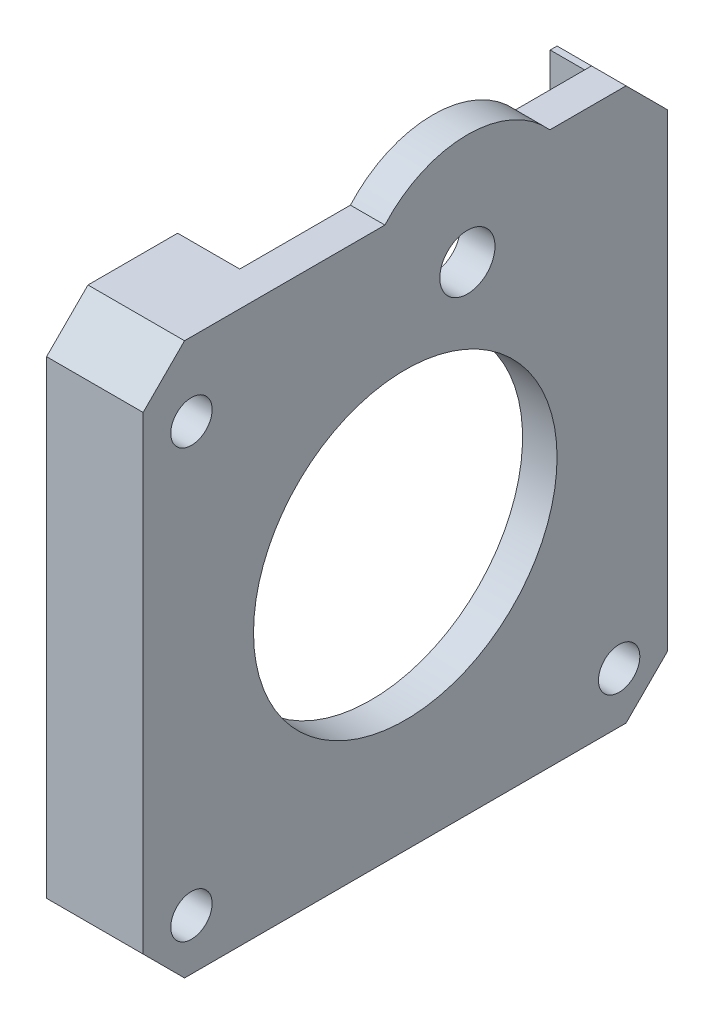
ISO-10303-21;
HEADER;
FILE_DESCRIPTION(('STEP AP214'),'2;1');
FILE_NAME('part.step','',(''),(''),'','','');
FILE_SCHEMA(('AUTOMOTIVE_DESIGN { 1 0 10303 214 1 1 1 1 }'));
ENDSEC;
DATA;
#1=APPLICATION_CONTEXT('core data for automotive mechanical design processes');
#2=APPLICATION_PROTOCOL_DEFINITION('international standard','automotive_design',2000,#1);
#3=PRODUCT_CONTEXT('',#1,'mechanical');
#4=PRODUCT('Part','Part','',(#3));
#5=PRODUCT_RELATED_PRODUCT_CATEGORY('part','',(#4));
#6=PRODUCT_DEFINITION_FORMATION('','',#4);
#7=PRODUCT_DEFINITION_CONTEXT('part definition',#1,'design');
#8=PRODUCT_DEFINITION('design','',#6,#7);
#9=PRODUCT_DEFINITION_SHAPE('','',#8);
#10=(LENGTH_UNIT() NAMED_UNIT(*) SI_UNIT(.MILLI.,.METRE.));
#11=(NAMED_UNIT(*) PLANE_ANGLE_UNIT() SI_UNIT($,.RADIAN.));
#12=(NAMED_UNIT(*) SI_UNIT($,.STERADIAN.) SOLID_ANGLE_UNIT());
#13=UNCERTAINTY_MEASURE_WITH_UNIT(LENGTH_MEASURE(1.E-05),#10,'distance_accuracy_value','');
#14=(GEOMETRIC_REPRESENTATION_CONTEXT(3) GLOBAL_UNCERTAINTY_ASSIGNED_CONTEXT((#13)) GLOBAL_UNIT_ASSIGNED_CONTEXT((#10,
#11,#12)) REPRESENTATION_CONTEXT('',''));
#15=CARTESIAN_POINT('',(0.,0.,0.));
#16=DIRECTION('',(0.,0.,1.));
#17=DIRECTION('',(1.,0.,0.));
#18=AXIS2_PLACEMENT_3D('',#15,#16,#17);
#19=CARTESIAN_POINT('',(7.,20.8157894736842,-10.4784933111502));
#20=DIRECTION('',(0.,-1.,0.));
#21=DIRECTION('',(0.,0.,-1.));
#22=AXIS2_PLACEMENT_3D('',#19,#20,#21);
#23=PLANE('',#22);
#24=DIRECTION('',(0.,0.,1.));
#25=VECTOR('',#24,1.);
#26=CARTESIAN_POINT('',(7.,20.8157894736842,-10.4784933111502));
#27=LINE('',#26,#25);
#28=CARTESIAN_POINT('',(7.,20.8157894736842,-16.));
#29=VERTEX_POINT('',#28);
#30=CARTESIAN_POINT('',(7.,20.8157894736842,-10.4784933111502));
#31=VERTEX_POINT('',#30);
#32=EDGE_CURVE('E335',#29,#31,#27,.T.);
#33=ORIENTED_EDGE('',*,*,#32,.F.);
#34=DIRECTION('',(-1.,0.,0.));
#35=VECTOR('',#34,1.);
#36=CARTESIAN_POINT('',(7.,20.8157894736842,-16.));
#37=LINE('',#36,#35);
#38=CARTESIAN_POINT('',(4.5,20.8157894736842,-16.));
#39=VERTEX_POINT('',#38);
#40=EDGE_CURVE('E398',#29,#39,#37,.T.);
#41=ORIENTED_EDGE('',*,*,#40,.T.);
#42=DIRECTION('',(0.,0.,-1.));
#43=VECTOR('',#42,1.);
#44=CARTESIAN_POINT('',(4.5,20.8157894736842,-10.4784933111502));
#45=LINE('',#44,#43);
#46=CARTESIAN_POINT('',(4.5,20.8157894736842,-10.4784933111502));
#47=VERTEX_POINT('',#46);
#48=EDGE_CURVE('E403',#47,#39,#45,.T.);
#49=ORIENTED_EDGE('',*,*,#48,.F.);
#50=DIRECTION('',(-1.,0.,0.));
#51=VECTOR('',#50,1.);
#52=CARTESIAN_POINT('',(7.,20.8157894736842,-10.4784933111502));
#53=LINE('',#52,#51);
#54=EDGE_CURVE('E360',#31,#47,#53,.T.);
#55=ORIENTED_EDGE('',*,*,#54,.F.);
#56=EDGE_LOOP('',(#33,#41,#49,#55));
#57=FACE_BOUND('',#56,.T.);
#58=ADVANCED_FACE('F39',(#57),#23,.F.);
#59=CARTESIAN_POINT('',(7.,15.5,-4.5));
#60=DIRECTION('',(-1.,0.,0.));
#61=DIRECTION('',(0.,0.,1.));
#62=AXIS2_PLACEMENT_3D('',#59,#60,#61);
#63=CYLINDRICAL_SURFACE('',#62,8.);
#64=CARTESIAN_POINT('',(4.5,15.5,-4.5));
#65=DIRECTION('',(-1.,0.,0.));
#66=DIRECTION('',(0.,0.,1.));
#67=AXIS2_PLACEMENT_3D('',#64,#65,#66);
#68=CIRCLE('',#67,8.);
#69=CARTESIAN_POINT('',(4.5,20.8157894736842,1.47849331115023));
#70=VERTEX_POINT('',#69);
#71=EDGE_CURVE('E407',#70,#47,#68,.T.);
#72=ORIENTED_EDGE('',*,*,#71,.F.);
#73=DIRECTION('',(-1.,0.,0.));
#74=VECTOR('',#73,1.);
#75=CARTESIAN_POINT('',(7.,20.8157894736842,1.47849331115023));
#76=LINE('',#75,#74);
#77=CARTESIAN_POINT('',(7.,20.8157894736842,1.47849331115023));
#78=VERTEX_POINT('',#77);
#79=EDGE_CURVE('E349',#78,#70,#76,.T.);
#80=ORIENTED_EDGE('',*,*,#79,.F.);
#81=CARTESIAN_POINT('',(7.,15.5,-4.5));
#82=DIRECTION('',(1.,0.,0.));
#83=DIRECTION('',(0.,0.,-1.));
#84=AXIS2_PLACEMENT_3D('',#81,#82,#83);
#85=CIRCLE('',#84,8.);
#86=EDGE_CURVE('E338',#31,#78,#85,.T.);
#87=ORIENTED_EDGE('',*,*,#86,.F.);
#88=ORIENTED_EDGE('',*,*,#54,.T.);
#89=EDGE_LOOP('',(#72,#80,#87,#88));
#90=FACE_BOUND('',#89,.T.);
#91=ADVANCED_FACE('F548',(#90),#63,.T.);
#92=CARTESIAN_POINT('',(7.,15.5,-4.5));
#93=DIRECTION('',(-1.,0.,0.));
#94=DIRECTION('',(0.,0.,1.));
#95=AXIS2_PLACEMENT_3D('',#92,#93,#94);
#96=CYLINDRICAL_SURFACE('',#95,2.);
#97=CARTESIAN_POINT('',(7.,15.5,-4.5));
#98=DIRECTION('',(1.,0.,0.));
#99=DIRECTION('',(0.,0.,-1.));
#100=AXIS2_PLACEMENT_3D('',#97,#98,#99);
#101=CIRCLE('',#100,2.);
#102=CARTESIAN_POINT('',(7.,15.5,-6.5));
#103=VERTEX_POINT('',#102);
#104=EDGE_CURVE('E326',#103,#103,#101,.T.);
#105=ORIENTED_EDGE('',*,*,#104,.T.);
#106=EDGE_LOOP('',(#105));
#107=FACE_BOUND('',#106,.T.);
#108=CARTESIAN_POINT('',(4.5,15.5,-4.5));
#109=DIRECTION('',(-1.,0.,0.));
#110=DIRECTION('',(0.,0.,1.));
#111=AXIS2_PLACEMENT_3D('',#108,#109,#110);
#112=CIRCLE('',#111,2.);
#113=CARTESIAN_POINT('',(4.5,15.5,-2.5));
#114=VERTEX_POINT('',#113);
#115=EDGE_CURVE('E304',#114,#114,#112,.T.);
#116=ORIENTED_EDGE('',*,*,#115,.T.);
#117=EDGE_LOOP('',(#116));
#118=FACE_BOUND('',#117,.T.);
#119=ADVANCED_FACE('F553',(#107,#118),#96,.F.);
#120=CARTESIAN_POINT('',(7.,0.,0.));
#121=DIRECTION('',(-1.,0.,0.));
#122=DIRECTION('',(0.,0.,1.));
#123=AXIS2_PLACEMENT_3D('',#120,#121,#122);
#124=CYLINDRICAL_SURFACE('',#123,11.);
#125=CARTESIAN_POINT('',(7.,0.,0.));
#126=DIRECTION('',(1.,0.,0.));
#127=DIRECTION('',(0.,0.,-1.));
#128=AXIS2_PLACEMENT_3D('',#125,#126,#127);
#129=CIRCLE('',#128,11.);
#130=CARTESIAN_POINT('',(7.,0.,-11.));
#131=VERTEX_POINT('',#130);
#132=EDGE_CURVE('E307',#131,#131,#129,.T.);
#133=ORIENTED_EDGE('',*,*,#132,.T.);
#134=EDGE_LOOP('',(#133));
#135=FACE_BOUND('',#134,.T.);
#136=CARTESIAN_POINT('',(4.5,0.,0.));
#137=DIRECTION('',(-1.,0.,0.));
#138=DIRECTION('',(0.,0.,1.));
#139=AXIS2_PLACEMENT_3D('',#136,#137,#138);
#140=CIRCLE('',#139,11.);
#141=CARTESIAN_POINT('',(4.5,0.,11.));
#142=VERTEX_POINT('',#141);
#143=EDGE_CURVE('E277',#142,#142,#140,.T.);
#144=ORIENTED_EDGE('',*,*,#143,.T.);
#145=EDGE_LOOP('',(#144));
#146=FACE_BOUND('',#145,.T.);
#147=ADVANCED_FACE('F667',(#135,#146),#124,.F.);
#148=CARTESIAN_POINT('',(7.,15.5,-4.5));
#149=DIRECTION('',(1.,0.,0.));
#150=DIRECTION('',(0.,0.,-1.));
#151=AXIS2_PLACEMENT_3D('',#148,#149,#150);
#152=PLANE('',#151);
#153=CARTESIAN_POINT('',(7.,-15.5,15.5));
#154=DIRECTION('',(1.,0.,0.));
#155=DIRECTION('',(0.,0.,-1.));
#156=AXIS2_PLACEMENT_3D('',#153,#154,#155);
#157=CIRCLE('',#156,1.5);
#158=CARTESIAN_POINT('',(7.,-15.5,14.));
#159=VERTEX_POINT('',#158);
#160=EDGE_CURVE('E311',#159,#159,#157,.T.);
#161=ORIENTED_EDGE('',*,*,#160,.F.);
#162=EDGE_LOOP('',(#161));
#163=FACE_BOUND('',#162,.T.);
#164=CARTESIAN_POINT('',(7.,-15.5,-15.5));
#165=DIRECTION('',(1.,0.,0.));
#166=DIRECTION('',(0.,0.,-1.));
#167=AXIS2_PLACEMENT_3D('',#164,#165,#166);
#168=CIRCLE('',#167,1.5);
#169=CARTESIAN_POINT('',(7.,-15.5,-17.));
#170=VERTEX_POINT('',#169);
#171=EDGE_CURVE('E323',#170,#170,#168,.T.);
#172=ORIENTED_EDGE('',*,*,#171,.F.);
#173=EDGE_LOOP('',(#172));
#174=FACE_BOUND('',#173,.T.);
#175=DIRECTION('',(0.,0.,-1.));
#176=VECTOR('',#175,1.);
#177=CARTESIAN_POINT('',(7.,-19.1842105263158,19.));
#178=LINE('',#177,#176);
#179=CARTESIAN_POINT('',(7.,-19.1842105263158,16.));
#180=VERTEX_POINT('',#179);
#181=CARTESIAN_POINT('',(7.,-19.1842105263158,-16.));
#182=VERTEX_POINT('',#181);
#183=EDGE_CURVE('E346',#180,#182,#178,.T.);
#184=ORIENTED_EDGE('',*,*,#183,.T.);
#185=DIRECTION('',(0.,-0.707106781186546,0.707106781186549));
#186=VECTOR('',#185,1.);
#187=CARTESIAN_POINT('',(7.,-7.59210526315797,-27.5921052631579));
#188=LINE('',#187,#186);
#189=CARTESIAN_POINT('',(7.,-16.1842105263158,-19.));
#190=VERTEX_POINT('',#189);
#191=EDGE_CURVE('E389',#182,#190,#188,.F.);
#192=ORIENTED_EDGE('',*,*,#191,.T.);
#193=DIRECTION('',(0.,1.,0.));
#194=VECTOR('',#193,1.);
#195=CARTESIAN_POINT('',(7.,20.8157894736842,-19.));
#196=LINE('',#195,#194);
#197=CARTESIAN_POINT('',(7.,17.8157894736842,-19.));
#198=VERTEX_POINT('',#197);
#199=EDGE_CURVE('E332',#190,#198,#196,.T.);
#200=ORIENTED_EDGE('',*,*,#199,.T.);
#201=DIRECTION('',(0.,-0.707106781186549,-0.707106781186546));
#202=VECTOR('',#201,1.);
#203=CARTESIAN_POINT('',(7.,23.9078947368421,-12.9078947368421));
#204=LINE('',#203,#202);
#205=EDGE_CURVE('E383',#198,#29,#204,.F.);
#206=ORIENTED_EDGE('',*,*,#205,.T.);
#207=ORIENTED_EDGE('',*,*,#32,.T.);
#208=ORIENTED_EDGE('',*,*,#86,.T.);
#209=DIRECTION('',(0.,0.,1.));
#210=VECTOR('',#209,1.);
#211=CARTESIAN_POINT('',(7.,20.8157894736842,19.));
#212=LINE('',#211,#210);
#213=CARTESIAN_POINT('',(7.,20.8157894736842,16.));
#214=VERTEX_POINT('',#213);
#215=EDGE_CURVE('E340',#78,#214,#212,.T.);
#216=ORIENTED_EDGE('',*,*,#215,.T.);
#217=DIRECTION('',(0.,0.707106781186546,-0.707106781186549));
#218=VECTOR('',#217,1.);
#219=CARTESIAN_POINT('',(7.,28.4078947368421,8.40789473684206));
#220=LINE('',#219,#218);
#221=CARTESIAN_POINT('',(7.,17.8157894736842,19.));
#222=VERTEX_POINT('',#221);
#223=EDGE_CURVE('E385',#214,#222,#220,.F.);
#224=ORIENTED_EDGE('',*,*,#223,.T.);
#225=DIRECTION('',(0.,-1.,0.));
#226=VECTOR('',#225,1.);
#227=CARTESIAN_POINT('',(7.,20.8157894736842,19.));
#228=LINE('',#227,#226);
#229=CARTESIAN_POINT('',(7.,-16.1842105263158,19.));
#230=VERTEX_POINT('',#229);
#231=EDGE_CURVE('E343',#222,#230,#228,.T.);
#232=ORIENTED_EDGE('',*,*,#231,.T.);
#233=DIRECTION('',(0.,0.707106781186549,0.707106781186546));
#234=VECTOR('',#233,1.);
#235=CARTESIAN_POINT('',(7.,-12.0921052631578,23.0921052631579));
#236=LINE('',#235,#234);
#237=EDGE_CURVE('E387',#230,#180,#236,.F.);
#238=ORIENTED_EDGE('',*,*,#237,.T.);
#239=EDGE_LOOP('',(#184,#192,#200,#206,#207,#208,#216,#224,#232,#238));
#240=FACE_BOUND('',#239,.T.);
#241=ORIENTED_EDGE('',*,*,#104,.F.);
#242=EDGE_LOOP('',(#241));
#243=FACE_BOUND('',#242,.T.);
#244=CARTESIAN_POINT('',(7.,15.5,15.5));
#245=DIRECTION('',(1.,0.,0.));
#246=DIRECTION('',(0.,0.,-1.));
#247=AXIS2_PLACEMENT_3D('',#244,#245,#246);
#248=CIRCLE('',#247,1.5);
#249=CARTESIAN_POINT('',(7.,15.5,14.));
#250=VERTEX_POINT('',#249);
#251=EDGE_CURVE('E317',#250,#250,#248,.T.);
#252=ORIENTED_EDGE('',*,*,#251,.F.);
#253=EDGE_LOOP('',(#252));
#254=FACE_BOUND('',#253,.T.);
#255=ORIENTED_EDGE('',*,*,#132,.F.);
#256=EDGE_LOOP('',(#255));
#257=FACE_BOUND('',#256,.T.);
#258=ADVANCED_FACE('F508',(#163,#174,#240,#243,#254,#257),#152,.T.);
#259=CARTESIAN_POINT('',(0.,15.5,-4.5));
#260=DIRECTION('',(1.,0.,0.));
#261=DIRECTION('',(0.,0.,-1.));
#262=AXIS2_PLACEMENT_3D('',#259,#260,#261);
#263=PLANE('',#262);
#264=DIRECTION('',(0.,1.,0.));
#265=VECTOR('',#264,1.);
#266=CARTESIAN_POINT('',(0.,20.8157894736842,-19.));
#267=LINE('',#266,#265);
#268=CARTESIAN_POINT('',(0.,-16.1842105263158,-19.));
#269=VERTEX_POINT('',#268);
#270=CARTESIAN_POINT('',(0.,17.8157894736842,-19.));
#271=VERTEX_POINT('',#270);
#272=EDGE_CURVE('E331',#269,#271,#267,.T.);
#273=ORIENTED_EDGE('',*,*,#272,.F.);
#274=DIRECTION('',(0.,0.707106781186546,-0.707106781186549));
#275=VECTOR('',#274,1.);
#276=CARTESIAN_POINT('',(0.,-16.1842105263158,-19.));
#277=LINE('',#276,#275);
#278=CARTESIAN_POINT('',(0.,-19.1842105263158,-16.));
#279=VERTEX_POINT('',#278);
#280=EDGE_CURVE('E376',#269,#279,#277,.F.);
#281=ORIENTED_EDGE('',*,*,#280,.T.);
#282=DIRECTION('',(0.,0.,-1.));
#283=VECTOR('',#282,1.);
#284=CARTESIAN_POINT('',(0.,-19.1842105263158,19.));
#285=LINE('',#284,#283);
#286=CARTESIAN_POINT('',(0.,-19.1842105263158,16.));
#287=VERTEX_POINT('',#286);
#288=EDGE_CURVE('E336',#287,#279,#285,.T.);
#289=ORIENTED_EDGE('',*,*,#288,.F.);
#290=DIRECTION('',(0.,-0.707106781186549,-0.707106781186546));
#291=VECTOR('',#290,1.);
#292=CARTESIAN_POINT('',(0.,-19.1842105263158,16.));
#293=LINE('',#292,#291);
#294=CARTESIAN_POINT('',(0.,-16.1842105263158,19.));
#295=VERTEX_POINT('',#294);
#296=EDGE_CURVE('E374',#287,#295,#293,.F.);
#297=ORIENTED_EDGE('',*,*,#296,.T.);
#298=DIRECTION('',(0.,-1.,0.));
#299=VECTOR('',#298,1.);
#300=CARTESIAN_POINT('',(0.,20.8157894736842,19.));
#301=LINE('',#300,#299);
#302=CARTESIAN_POINT('',(0.,17.8157894736842,19.));
#303=VERTEX_POINT('',#302);
#304=EDGE_CURVE('E353',#303,#295,#301,.T.);
#305=ORIENTED_EDGE('',*,*,#304,.F.);
#306=DIRECTION('',(0.,-0.707106781186546,0.707106781186549));
#307=VECTOR('',#306,1.);
#308=CARTESIAN_POINT('',(0.,17.8157894736842,19.));
#309=LINE('',#308,#307);
#310=CARTESIAN_POINT('',(0.,20.8157894736842,16.));
#311=VERTEX_POINT('',#310);
#312=EDGE_CURVE('E372',#303,#311,#309,.F.);
#313=ORIENTED_EDGE('',*,*,#312,.T.);
#314=DIRECTION('',(0.,0.,1.));
#315=VECTOR('',#314,1.);
#316=CARTESIAN_POINT('',(0.,20.8157894736842,19.));
#317=LINE('',#316,#315);
#318=CARTESIAN_POINT('',(0.,20.8157894736842,9.50000000000001));
#319=VERTEX_POINT('',#318);
#320=EDGE_CURVE('E233',#319,#311,#317,.T.);
#321=ORIENTED_EDGE('',*,*,#320,.F.);
#322=DIRECTION('',(0.,1.,0.));
#323=VECTOR('',#322,1.);
#324=CARTESIAN_POINT('',(0.,18.8157894736842,9.50000000000001));
#325=LINE('',#324,#323);
#326=CARTESIAN_POINT('',(0.,18.8157894736842,9.50000000000001));
#327=VERTEX_POINT('',#326);
#328=EDGE_CURVE('E213',#327,#319,#325,.T.);
#329=ORIENTED_EDGE('',*,*,#328,.F.);
#330=DIRECTION('',(0.,0.,-1.));
#331=VECTOR('',#330,1.);
#332=CARTESIAN_POINT('',(0.,18.8157894736842,13.));
#333=LINE('',#332,#331);
#334=CARTESIAN_POINT('',(0.,18.8157894736842,13.));
#335=VERTEX_POINT('',#334);
#336=EDGE_CURVE('E231',#335,#327,#333,.T.);
#337=ORIENTED_EDGE('',*,*,#336,.F.);
#338=DIRECTION('',(0.,1.,0.));
#339=VECTOR('',#338,1.);
#340=CARTESIAN_POINT('',(0.,15.5,13.));
#341=LINE('',#340,#339);
#342=CARTESIAN_POINT('',(0.,15.5,13.));
#343=VERTEX_POINT('',#342);
#344=EDGE_CURVE('E239',#343,#335,#341,.T.);
#345=ORIENTED_EDGE('',*,*,#344,.F.);
#346=CARTESIAN_POINT('',(0.,15.5,15.5));
#347=DIRECTION('',(1.,0.,0.));
#348=DIRECTION('',(0.,0.,1.));
#349=AXIS2_PLACEMENT_3D('',#346,#347,#348);
#350=CIRCLE('',#349,2.5);
#351=CARTESIAN_POINT('',(0.,13.,15.5));
#352=VERTEX_POINT('',#351);
#353=EDGE_CURVE('E244',#352,#343,#350,.T.);
#354=ORIENTED_EDGE('',*,*,#353,.F.);
#355=DIRECTION('',(0.,0.,-1.));
#356=VECTOR('',#355,1.);
#357=CARTESIAN_POINT('',(0.,13.,15.5));
#358=LINE('',#357,#356);
#359=CARTESIAN_POINT('',(0.,13.,17.5));
#360=VERTEX_POINT('',#359);
#361=EDGE_CURVE('E271',#360,#352,#358,.T.);
#362=ORIENTED_EDGE('',*,*,#361,.F.);
#363=DIRECTION('',(0.,1.,0.));
#364=VECTOR('',#363,1.);
#365=CARTESIAN_POINT('',(0.,-13.,17.5));
#366=LINE('',#365,#364);
#367=CARTESIAN_POINT('',(0.,-13.,17.5));
#368=VERTEX_POINT('',#367);
#369=EDGE_CURVE('E268',#368,#360,#366,.T.);
#370=ORIENTED_EDGE('',*,*,#369,.F.);
#371=DIRECTION('',(0.,0.,1.));
#372=VECTOR('',#371,1.);
#373=CARTESIAN_POINT('',(0.,-13.,15.5));
#374=LINE('',#373,#372);
#375=CARTESIAN_POINT('',(0.,-13.,15.5));
#376=VERTEX_POINT('',#375);
#377=EDGE_CURVE('E265',#376,#368,#374,.T.);
#378=ORIENTED_EDGE('',*,*,#377,.F.);
#379=CARTESIAN_POINT('',(0.,-15.5,15.5));
#380=DIRECTION('',(1.,0.,0.));
#381=DIRECTION('',(0.,0.,1.));
#382=AXIS2_PLACEMENT_3D('',#379,#380,#381);
#383=CIRCLE('',#382,2.5);
#384=CARTESIAN_POINT('',(0.,-15.5,13.));
#385=VERTEX_POINT('',#384);
#386=EDGE_CURVE('E262',#385,#376,#383,.T.);
#387=ORIENTED_EDGE('',*,*,#386,.F.);
#388=DIRECTION('',(0.,1.,0.));
#389=VECTOR('',#388,1.);
#390=CARTESIAN_POINT('',(0.,-15.5,13.));
#391=LINE('',#390,#389);
#392=CARTESIAN_POINT('',(0.,-17.6842105263158,13.));
#393=VERTEX_POINT('',#392);
#394=EDGE_CURVE('E259',#393,#385,#391,.T.);
#395=ORIENTED_EDGE('',*,*,#394,.F.);
#396=DIRECTION('',(0.,0.,1.));
#397=VECTOR('',#396,1.);
#398=CARTESIAN_POINT('',(0.,-17.6842105263158,13.));
#399=LINE('',#398,#397);
#400=CARTESIAN_POINT('',(0.,-17.6842105263158,-13.));
#401=VERTEX_POINT('',#400);
#402=EDGE_CURVE('E256',#401,#393,#399,.T.);
#403=ORIENTED_EDGE('',*,*,#402,.F.);
#404=DIRECTION('',(0.,-1.,0.));
#405=VECTOR('',#404,1.);
#406=CARTESIAN_POINT('',(0.,-15.5,-13.));
#407=LINE('',#406,#405);
#408=CARTESIAN_POINT('',(0.,-15.5,-13.));
#409=VERTEX_POINT('',#408);
#410=EDGE_CURVE('E253',#409,#401,#407,.T.);
#411=ORIENTED_EDGE('',*,*,#410,.F.);
#412=CARTESIAN_POINT('',(0.,-15.5,-15.5));
#413=DIRECTION('',(1.,0.,0.));
#414=DIRECTION('',(0.,0.,1.));
#415=AXIS2_PLACEMENT_3D('',#412,#413,#414);
#416=CIRCLE('',#415,2.5);
#417=CARTESIAN_POINT('',(0.,-13.,-15.5));
#418=VERTEX_POINT('',#417);
#419=EDGE_CURVE('E250',#418,#409,#416,.T.);
#420=ORIENTED_EDGE('',*,*,#419,.F.);
#421=DIRECTION('',(0.,0.,1.));
#422=VECTOR('',#421,1.);
#423=CARTESIAN_POINT('',(0.,-13.,-15.5));
#424=LINE('',#423,#422);
#425=CARTESIAN_POINT('',(0.,-13.,-17.5));
#426=VERTEX_POINT('',#425);
#427=EDGE_CURVE('E242',#426,#418,#424,.T.);
#428=ORIENTED_EDGE('',*,*,#427,.F.);
#429=DIRECTION('',(0.,-1.,0.));
#430=VECTOR('',#429,1.);
#431=CARTESIAN_POINT('',(0.,-13.,-17.5));
#432=LINE('',#431,#430);
#433=CARTESIAN_POINT('',(0.,18.8157894736842,-17.5));
#434=VERTEX_POINT('',#433);
#435=EDGE_CURVE('E238',#434,#426,#432,.T.);
#436=ORIENTED_EDGE('',*,*,#435,.F.);
#437=DIRECTION('',(0.,0.,1.));
#438=VECTOR('',#437,1.);
#439=CARTESIAN_POINT('',(0.,18.8157894736842,9.50000000000001));
#440=LINE('',#439,#438);
#441=CARTESIAN_POINT('',(0.,18.8157894736842,-18.));
#442=VERTEX_POINT('',#441);
#443=EDGE_CURVE('E222',#442,#434,#440,.T.);
#444=ORIENTED_EDGE('',*,*,#443,.F.);
#445=DIRECTION('',(0.,0.707106781186549,0.707106781186546));
#446=VECTOR('',#445,1.);
#447=CARTESIAN_POINT('',(0.,20.8157894736842,-16.));
#448=LINE('',#447,#446);
#449=EDGE_CURVE('E370',#442,#271,#448,.F.);
#450=ORIENTED_EDGE('',*,*,#449,.T.);
#451=EDGE_LOOP('',(#273,#281,#289,#297,#305,#313,#321,#329,#337,#345,#354,#362,#370,#378,#387,
#395,#403,#411,#420,#428,#436,#444,#450));
#452=FACE_BOUND('',#451,.T.);
#453=CARTESIAN_POINT('',(0.,-15.5,-15.5));
#454=DIRECTION('',(1.,0.,0.));
#455=DIRECTION('',(0.,0.,-1.));
#456=AXIS2_PLACEMENT_3D('',#453,#454,#455);
#457=CIRCLE('',#456,1.5);
#458=CARTESIAN_POINT('',(0.,-15.5,-17.));
#459=VERTEX_POINT('',#458);
#460=EDGE_CURVE('E320',#459,#459,#457,.T.);
#461=ORIENTED_EDGE('',*,*,#460,.T.);
#462=EDGE_LOOP('',(#461));
#463=FACE_BOUND('',#462,.T.);
#464=CARTESIAN_POINT('',(0.,15.5,15.5));
#465=DIRECTION('',(1.,0.,0.));
#466=DIRECTION('',(0.,0.,-1.));
#467=AXIS2_PLACEMENT_3D('',#464,#465,#466);
#468=CIRCLE('',#467,1.5);
#469=CARTESIAN_POINT('',(0.,15.5,14.));
#470=VERTEX_POINT('',#469);
#471=EDGE_CURVE('E314',#470,#470,#468,.T.);
#472=ORIENTED_EDGE('',*,*,#471,.T.);
#473=EDGE_LOOP('',(#472));
#474=FACE_BOUND('',#473,.T.);
#475=CARTESIAN_POINT('',(0.,-15.5,15.5));
#476=DIRECTION('',(1.,0.,0.));
#477=DIRECTION('',(0.,0.,-1.));
#478=AXIS2_PLACEMENT_3D('',#475,#476,#477);
#479=CIRCLE('',#478,1.5);
#480=CARTESIAN_POINT('',(0.,-15.5,14.));
#481=VERTEX_POINT('',#480);
#482=EDGE_CURVE('E310',#481,#481,#479,.T.);
#483=ORIENTED_EDGE('',*,*,#482,.T.);
#484=EDGE_LOOP('',(#483));
#485=FACE_BOUND('',#484,.T.);
#486=ADVANCED_FACE('F228',(#452,#463,#474,#485),#263,.F.);
#487=CARTESIAN_POINT('',(7.,20.8157894736842,-19.));
#488=DIRECTION('',(0.,0.,1.));
#489=DIRECTION('',(0.,-1.,0.));
#490=AXIS2_PLACEMENT_3D('',#487,#488,#489);
#491=PLANE('',#490);
#492=ORIENTED_EDGE('',*,*,#199,.F.);
#493=DIRECTION('',(-1.,0.,0.));
#494=VECTOR('',#493,1.);
#495=CARTESIAN_POINT('',(7.,-16.1842105263158,-19.));
#496=LINE('',#495,#494);
#497=EDGE_CURVE('E367',#190,#269,#496,.T.);
#498=ORIENTED_EDGE('',*,*,#497,.T.);
#499=ORIENTED_EDGE('',*,*,#272,.T.);
#500=DIRECTION('',(1.,0.,0.));
#501=VECTOR('',#500,1.);
#502=CARTESIAN_POINT('',(7.,17.8157894736842,-19.));
#503=LINE('',#502,#501);
#504=EDGE_CURVE('E363',#271,#198,#503,.T.);
#505=ORIENTED_EDGE('',*,*,#504,.T.);
#506=EDGE_LOOP('',(#492,#498,#499,#505));
#507=FACE_BOUND('',#506,.T.);
#508=ADVANCED_FACE('F505',(#507),#491,.F.);
#509=CARTESIAN_POINT('',(7.,20.8157894736842,19.));
#510=DIRECTION('',(0.,-1.,0.));
#511=DIRECTION('',(0.,0.,-1.));
#512=AXIS2_PLACEMENT_3D('',#509,#510,#511);
#513=PLANE('',#512);
#514=ORIENTED_EDGE('',*,*,#320,.T.);
#515=DIRECTION('',(1.,0.,0.));
#516=VECTOR('',#515,1.);
#517=CARTESIAN_POINT('',(7.,20.8157894736842,16.));
#518=LINE('',#517,#516);
#519=EDGE_CURVE('E396',#311,#214,#518,.T.);
#520=ORIENTED_EDGE('',*,*,#519,.T.);
#521=ORIENTED_EDGE('',*,*,#215,.F.);
#522=ORIENTED_EDGE('',*,*,#79,.T.);
#523=DIRECTION('',(0.,0.,-1.));
#524=VECTOR('',#523,1.);
#525=CARTESIAN_POINT('',(4.5,20.8157894736842,19.));
#526=LINE('',#525,#524);
#527=CARTESIAN_POINT('',(4.5,20.8157894736842,9.50000000000001));
#528=VERTEX_POINT('',#527);
#529=EDGE_CURVE('E411',#528,#70,#526,.T.);
#530=ORIENTED_EDGE('',*,*,#529,.F.);
#531=DIRECTION('',(-1.,0.,0.));
#532=VECTOR('',#531,1.);
#533=CARTESIAN_POINT('',(7.,20.8157894736842,9.50000000000001));
#534=LINE('',#533,#532);
#535=EDGE_CURVE('E408',#528,#319,#534,.T.);
#536=ORIENTED_EDGE('',*,*,#535,.T.);
#537=EDGE_LOOP('',(#514,#520,#521,#522,#530,#536));
#538=FACE_BOUND('',#537,.T.);
#539=ADVANCED_FACE('F533',(#538),#513,.F.);
#540=CARTESIAN_POINT('',(7.,20.8157894736842,19.));
#541=DIRECTION('',(0.,0.,-1.));
#542=DIRECTION('',(0.,1.,0.));
#543=AXIS2_PLACEMENT_3D('',#540,#541,#542);
#544=PLANE('',#543);
#545=ORIENTED_EDGE('',*,*,#304,.T.);
#546=DIRECTION('',(1.,0.,0.));
#547=VECTOR('',#546,1.);
#548=CARTESIAN_POINT('',(7.,-16.1842105263158,19.));
#549=LINE('',#548,#547);
#550=EDGE_CURVE('E394',#295,#230,#549,.T.);
#551=ORIENTED_EDGE('',*,*,#550,.T.);
#552=ORIENTED_EDGE('',*,*,#231,.F.);
#553=DIRECTION('',(-1.,0.,0.));
#554=VECTOR('',#553,1.);
#555=CARTESIAN_POINT('',(7.,17.8157894736842,19.));
#556=LINE('',#555,#554);
#557=EDGE_CURVE('E391',#222,#303,#556,.T.);
#558=ORIENTED_EDGE('',*,*,#557,.T.);
#559=EDGE_LOOP('',(#545,#551,#552,#558));
#560=FACE_BOUND('',#559,.T.);
#561=ADVANCED_FACE('F525',(#560),#544,.F.);
#562=CARTESIAN_POINT('',(7.,-19.1842105263158,19.));
#563=DIRECTION('',(0.,1.,0.));
#564=DIRECTION('',(0.,0.,1.));
#565=AXIS2_PLACEMENT_3D('',#562,#563,#564);
#566=PLANE('',#565);
#567=ORIENTED_EDGE('',*,*,#288,.T.);
#568=DIRECTION('',(1.,0.,0.));
#569=VECTOR('',#568,1.);
#570=CARTESIAN_POINT('',(7.,-19.1842105263158,-16.));
#571=LINE('',#570,#569);
#572=EDGE_CURVE('E381',#279,#182,#571,.T.);
#573=ORIENTED_EDGE('',*,*,#572,.T.);
#574=ORIENTED_EDGE('',*,*,#183,.F.);
#575=DIRECTION('',(-1.,0.,0.));
#576=VECTOR('',#575,1.);
#577=CARTESIAN_POINT('',(7.,-19.1842105263158,16.));
#578=LINE('',#577,#576);
#579=EDGE_CURVE('E378',#180,#287,#578,.T.);
#580=ORIENTED_EDGE('',*,*,#579,.T.);
#581=EDGE_LOOP('',(#567,#573,#574,#580));
#582=FACE_BOUND('',#581,.T.);
#583=ADVANCED_FACE('F517',(#582),#566,.F.);
#584=CARTESIAN_POINT('',(7.,-15.5,-15.5));
#585=DIRECTION('',(-1.,0.,0.));
#586=DIRECTION('',(0.,0.,1.));
#587=AXIS2_PLACEMENT_3D('',#584,#585,#586);
#588=CYLINDRICAL_SURFACE('',#587,1.5);
#589=ORIENTED_EDGE('',*,*,#171,.T.);
#590=EDGE_LOOP('',(#589));
#591=FACE_BOUND('',#590,.T.);
#592=ORIENTED_EDGE('',*,*,#460,.F.);
#593=EDGE_LOOP('',(#592));
#594=FACE_BOUND('',#593,.T.);
#595=ADVANCED_FACE('F623',(#591,#594),#588,.F.);
#596=CARTESIAN_POINT('',(7.,15.5,15.5));
#597=DIRECTION('',(-1.,0.,0.));
#598=DIRECTION('',(0.,0.,1.));
#599=AXIS2_PLACEMENT_3D('',#596,#597,#598);
#600=CYLINDRICAL_SURFACE('',#599,1.5);
#601=ORIENTED_EDGE('',*,*,#251,.T.);
#602=EDGE_LOOP('',(#601));
#603=FACE_BOUND('',#602,.T.);
#604=ORIENTED_EDGE('',*,*,#471,.F.);
#605=EDGE_LOOP('',(#604));
#606=FACE_BOUND('',#605,.T.);
#607=ADVANCED_FACE('F831',(#603,#606),#600,.F.);
#608=CARTESIAN_POINT('',(7.,-15.5,15.5));
#609=DIRECTION('',(-1.,0.,0.));
#610=DIRECTION('',(0.,0.,1.));
#611=AXIS2_PLACEMENT_3D('',#608,#609,#610);
#612=CYLINDRICAL_SURFACE('',#611,1.5);
#613=ORIENTED_EDGE('',*,*,#160,.T.);
#614=EDGE_LOOP('',(#613));
#615=FACE_BOUND('',#614,.T.);
#616=ORIENTED_EDGE('',*,*,#482,.F.);
#617=EDGE_LOOP('',(#616));
#618=FACE_BOUND('',#617,.T.);
#619=ADVANCED_FACE('F804',(#615,#618),#612,.F.);
#620=CARTESIAN_POINT('',(4.5,15.5,15.5));
#621=DIRECTION('',(-1.,0.,0.));
#622=DIRECTION('',(0.,0.,1.));
#623=AXIS2_PLACEMENT_3D('',#620,#621,#622);
#624=CYLINDRICAL_SURFACE('',#623,2.5);
#625=ORIENTED_EDGE('',*,*,#353,.T.);
#626=DIRECTION('',(-1.,0.,0.));
#627=VECTOR('',#626,1.);
#628=CARTESIAN_POINT('',(4.5,15.5,13.));
#629=LINE('',#628,#627);
#630=CARTESIAN_POINT('',(4.5,15.5,13.));
#631=VERTEX_POINT('',#630);
#632=EDGE_CURVE('E300',#631,#343,#629,.T.);
#633=ORIENTED_EDGE('',*,*,#632,.F.);
#634=CARTESIAN_POINT('',(4.5,15.5,15.5));
#635=DIRECTION('',(1.,0.,0.));
#636=DIRECTION('',(0.,0.,1.));
#637=AXIS2_PLACEMENT_3D('',#634,#635,#636);
#638=CIRCLE('',#637,2.5);
#639=CARTESIAN_POINT('',(4.5,13.,15.5));
#640=VERTEX_POINT('',#639);
#641=EDGE_CURVE('E274',#640,#631,#638,.T.);
#642=ORIENTED_EDGE('',*,*,#641,.F.);
#643=DIRECTION('',(-1.,0.,0.));
#644=VECTOR('',#643,1.);
#645=CARTESIAN_POINT('',(4.5,13.,15.5));
#646=LINE('',#645,#644);
#647=EDGE_CURVE('E275',#640,#352,#646,.T.);
#648=ORIENTED_EDGE('',*,*,#647,.T.);
#649=EDGE_LOOP('',(#625,#633,#642,#648));
#650=FACE_BOUND('',#649,.T.);
#651=ADVANCED_FACE('F452',(#650),#624,.T.);
#652=CARTESIAN_POINT('',(4.5,13.,15.5));
#653=DIRECTION('',(0.,1.,0.));
#654=DIRECTION('',(0.,0.,1.));
#655=AXIS2_PLACEMENT_3D('',#652,#653,#654);
#656=PLANE('',#655);
#657=ORIENTED_EDGE('',*,*,#361,.T.);
#658=ORIENTED_EDGE('',*,*,#647,.F.);
#659=DIRECTION('',(0.,0.,-1.));
#660=VECTOR('',#659,1.);
#661=CARTESIAN_POINT('',(4.5,13.,15.5));
#662=LINE('',#661,#660);
#663=CARTESIAN_POINT('',(4.5,13.,17.5));
#664=VERTEX_POINT('',#663);
#665=EDGE_CURVE('E303',#664,#640,#662,.T.);
#666=ORIENTED_EDGE('',*,*,#665,.F.);
#667=DIRECTION('',(-1.,0.,0.));
#668=VECTOR('',#667,1.);
#669=CARTESIAN_POINT('',(4.5,13.,17.5));
#670=LINE('',#669,#668);
#671=EDGE_CURVE('E278',#664,#360,#670,.T.);
#672=ORIENTED_EDGE('',*,*,#671,.T.);
#673=EDGE_LOOP('',(#657,#658,#666,#672));
#674=FACE_BOUND('',#673,.T.);
#675=ADVANCED_FACE('F461',(#674),#656,.F.);
#676=CARTESIAN_POINT('',(4.5,-13.,17.5));
#677=DIRECTION('',(0.,0.,1.));
#678=DIRECTION('',(1.,0.,0.));
#679=AXIS2_PLACEMENT_3D('',#676,#677,#678);
#680=PLANE('',#679);
#681=ORIENTED_EDGE('',*,*,#369,.T.);
#682=ORIENTED_EDGE('',*,*,#671,.F.);
#683=DIRECTION('',(0.,1.,0.));
#684=VECTOR('',#683,1.);
#685=CARTESIAN_POINT('',(4.5,-13.,17.5));
#686=LINE('',#685,#684);
#687=CARTESIAN_POINT('',(4.5,-13.,17.5));
#688=VERTEX_POINT('',#687);
#689=EDGE_CURVE('E446',#688,#664,#686,.T.);
#690=ORIENTED_EDGE('',*,*,#689,.F.);
#691=DIRECTION('',(-1.,0.,0.));
#692=VECTOR('',#691,1.);
#693=CARTESIAN_POINT('',(4.5,-13.,17.5));
#694=LINE('',#693,#692);
#695=EDGE_CURVE('E280',#688,#368,#694,.T.);
#696=ORIENTED_EDGE('',*,*,#695,.T.);
#697=EDGE_LOOP('',(#681,#682,#690,#696));
#698=FACE_BOUND('',#697,.T.);
#699=ADVANCED_FACE('F466',(#698),#680,.F.);
#700=CARTESIAN_POINT('',(4.5,-13.,15.5));
#701=DIRECTION('',(0.,-1.,0.));
#702=DIRECTION('',(0.,0.,-1.));
#703=AXIS2_PLACEMENT_3D('',#700,#701,#702);
#704=PLANE('',#703);
#705=ORIENTED_EDGE('',*,*,#377,.T.);
#706=ORIENTED_EDGE('',*,*,#695,.F.);
#707=DIRECTION('',(0.,0.,1.));
#708=VECTOR('',#707,1.);
#709=CARTESIAN_POINT('',(4.5,-13.,15.5));
#710=LINE('',#709,#708);
#711=CARTESIAN_POINT('',(4.5,-13.,15.5));
#712=VERTEX_POINT('',#711);
#713=EDGE_CURVE('E443',#712,#688,#710,.T.);
#714=ORIENTED_EDGE('',*,*,#713,.F.);
#715=DIRECTION('',(-1.,0.,0.));
#716=VECTOR('',#715,1.);
#717=CARTESIAN_POINT('',(4.5,-13.,15.5));
#718=LINE('',#717,#716);
#719=EDGE_CURVE('E282',#712,#376,#718,.T.);
#720=ORIENTED_EDGE('',*,*,#719,.T.);
#721=EDGE_LOOP('',(#705,#706,#714,#720));
#722=FACE_BOUND('',#721,.T.);
#723=ADVANCED_FACE('F469',(#722),#704,.F.);
#724=CARTESIAN_POINT('',(4.5,-15.5,15.5));
#725=DIRECTION('',(-1.,0.,0.));
#726=DIRECTION('',(0.,0.,1.));
#727=AXIS2_PLACEMENT_3D('',#724,#725,#726);
#728=CYLINDRICAL_SURFACE('',#727,2.5);
#729=ORIENTED_EDGE('',*,*,#386,.T.);
#730=ORIENTED_EDGE('',*,*,#719,.F.);
#731=CARTESIAN_POINT('',(4.5,-15.5,15.5));
#732=DIRECTION('',(1.,0.,0.));
#733=DIRECTION('',(0.,0.,1.));
#734=AXIS2_PLACEMENT_3D('',#731,#732,#733);
#735=CIRCLE('',#734,2.5);
#736=CARTESIAN_POINT('',(4.5,-15.5,13.));
#737=VERTEX_POINT('',#736);
#738=EDGE_CURVE('E440',#737,#712,#735,.T.);
#739=ORIENTED_EDGE('',*,*,#738,.F.);
#740=DIRECTION('',(-1.,0.,0.));
#741=VECTOR('',#740,1.);
#742=CARTESIAN_POINT('',(4.5,-15.5,13.));
#743=LINE('',#742,#741);
#744=EDGE_CURVE('E284',#737,#385,#743,.T.);
#745=ORIENTED_EDGE('',*,*,#744,.T.);
#746=EDGE_LOOP('',(#729,#730,#739,#745));
#747=FACE_BOUND('',#746,.T.);
#748=ADVANCED_FACE('F472',(#747),#728,.T.);
#749=CARTESIAN_POINT('',(4.5,-15.5,13.));
#750=DIRECTION('',(0.,0.,1.));
#751=DIRECTION('',(1.,0.,0.));
#752=AXIS2_PLACEMENT_3D('',#749,#750,#751);
#753=PLANE('',#752);
#754=ORIENTED_EDGE('',*,*,#394,.T.);
#755=ORIENTED_EDGE('',*,*,#744,.F.);
#756=DIRECTION('',(0.,1.,0.));
#757=VECTOR('',#756,1.);
#758=CARTESIAN_POINT('',(4.5,-15.5,13.));
#759=LINE('',#758,#757);
#760=CARTESIAN_POINT('',(4.5,-17.6842105263158,13.));
#761=VERTEX_POINT('',#760);
#762=EDGE_CURVE('E437',#761,#737,#759,.T.);
#763=ORIENTED_EDGE('',*,*,#762,.F.);
#764=DIRECTION('',(-1.,0.,0.));
#765=VECTOR('',#764,1.);
#766=CARTESIAN_POINT('',(4.5,-17.6842105263158,13.));
#767=LINE('',#766,#765);
#768=EDGE_CURVE('E286',#761,#393,#767,.T.);
#769=ORIENTED_EDGE('',*,*,#768,.T.);
#770=EDGE_LOOP('',(#754,#755,#763,#769));
#771=FACE_BOUND('',#770,.T.);
#772=ADVANCED_FACE('F477',(#771),#753,.F.);
#773=CARTESIAN_POINT('',(4.5,-17.6842105263158,13.));
#774=DIRECTION('',(0.,-1.,0.));
#775=DIRECTION('',(0.,0.,-1.));
#776=AXIS2_PLACEMENT_3D('',#773,#774,#775);
#777=PLANE('',#776);
#778=ORIENTED_EDGE('',*,*,#402,.T.);
#779=ORIENTED_EDGE('',*,*,#768,.F.);
#780=DIRECTION('',(0.,0.,1.));
#781=VECTOR('',#780,1.);
#782=CARTESIAN_POINT('',(4.5,-17.6842105263158,13.));
#783=LINE('',#782,#781);
#784=CARTESIAN_POINT('',(4.5,-17.6842105263158,-13.));
#785=VERTEX_POINT('',#784);
#786=EDGE_CURVE('E434',#785,#761,#783,.T.);
#787=ORIENTED_EDGE('',*,*,#786,.F.);
#788=DIRECTION('',(-1.,0.,0.));
#789=VECTOR('',#788,1.);
#790=CARTESIAN_POINT('',(4.5,-17.6842105263158,-13.));
#791=LINE('',#790,#789);
#792=EDGE_CURVE('E288',#785,#401,#791,.T.);
#793=ORIENTED_EDGE('',*,*,#792,.T.);
#794=EDGE_LOOP('',(#778,#779,#787,#793));
#795=FACE_BOUND('',#794,.T.);
#796=ADVANCED_FACE('F481',(#795),#777,.F.);
#797=CARTESIAN_POINT('',(4.5,-15.5,-13.));
#798=DIRECTION('',(0.,0.,-1.));
#799=DIRECTION('',(-1.,0.,0.));
#800=AXIS2_PLACEMENT_3D('',#797,#798,#799);
#801=PLANE('',#800);
#802=ORIENTED_EDGE('',*,*,#410,.T.);
#803=ORIENTED_EDGE('',*,*,#792,.F.);
#804=DIRECTION('',(0.,-1.,0.));
#805=VECTOR('',#804,1.);
#806=CARTESIAN_POINT('',(4.5,-15.5,-13.));
#807=LINE('',#806,#805);
#808=CARTESIAN_POINT('',(4.5,-15.5,-13.));
#809=VERTEX_POINT('',#808);
#810=EDGE_CURVE('E431',#809,#785,#807,.T.);
#811=ORIENTED_EDGE('',*,*,#810,.F.);
#812=DIRECTION('',(-1.,0.,0.));
#813=VECTOR('',#812,1.);
#814=CARTESIAN_POINT('',(4.5,-15.5,-13.));
#815=LINE('',#814,#813);
#816=EDGE_CURVE('E290',#809,#409,#815,.T.);
#817=ORIENTED_EDGE('',*,*,#816,.T.);
#818=EDGE_LOOP('',(#802,#803,#811,#817));
#819=FACE_BOUND('',#818,.T.);
#820=ADVANCED_FACE('F484',(#819),#801,.F.);
#821=CARTESIAN_POINT('',(4.5,-15.5,-15.5));
#822=DIRECTION('',(-1.,0.,0.));
#823=DIRECTION('',(0.,0.,1.));
#824=AXIS2_PLACEMENT_3D('',#821,#822,#823);
#825=CYLINDRICAL_SURFACE('',#824,2.5);
#826=ORIENTED_EDGE('',*,*,#419,.T.);
#827=ORIENTED_EDGE('',*,*,#816,.F.);
#828=CARTESIAN_POINT('',(4.5,-15.5,-15.5));
#829=DIRECTION('',(1.,0.,0.));
#830=DIRECTION('',(0.,0.,1.));
#831=AXIS2_PLACEMENT_3D('',#828,#829,#830);
#832=CIRCLE('',#831,2.5);
#833=CARTESIAN_POINT('',(4.5,-13.,-15.5));
#834=VERTEX_POINT('',#833);
#835=EDGE_CURVE('E428',#834,#809,#832,.T.);
#836=ORIENTED_EDGE('',*,*,#835,.F.);
#837=DIRECTION('',(-1.,0.,0.));
#838=VECTOR('',#837,1.);
#839=CARTESIAN_POINT('',(4.5,-13.,-15.5));
#840=LINE('',#839,#838);
#841=EDGE_CURVE('E292',#834,#418,#840,.T.);
#842=ORIENTED_EDGE('',*,*,#841,.T.);
#843=EDGE_LOOP('',(#826,#827,#836,#842));
#844=FACE_BOUND('',#843,.T.);
#845=ADVANCED_FACE('F489',(#844),#825,.T.);
#846=CARTESIAN_POINT('',(4.5,-13.,-15.5));
#847=DIRECTION('',(0.,-1.,0.));
#848=DIRECTION('',(0.,0.,-1.));
#849=AXIS2_PLACEMENT_3D('',#846,#847,#848);
#850=PLANE('',#849);
#851=ORIENTED_EDGE('',*,*,#427,.T.);
#852=ORIENTED_EDGE('',*,*,#841,.F.);
#853=DIRECTION('',(0.,0.,1.));
#854=VECTOR('',#853,1.);
#855=CARTESIAN_POINT('',(4.5,-13.,-15.5));
#856=LINE('',#855,#854);
#857=CARTESIAN_POINT('',(4.5,-13.,-17.5));
#858=VERTEX_POINT('',#857);
#859=EDGE_CURVE('E425',#858,#834,#856,.T.);
#860=ORIENTED_EDGE('',*,*,#859,.F.);
#861=DIRECTION('',(-1.,0.,0.));
#862=VECTOR('',#861,1.);
#863=CARTESIAN_POINT('',(4.5,-13.,-17.5));
#864=LINE('',#863,#862);
#865=EDGE_CURVE('E294',#858,#426,#864,.T.);
#866=ORIENTED_EDGE('',*,*,#865,.T.);
#867=EDGE_LOOP('',(#851,#852,#860,#866));
#868=FACE_BOUND('',#867,.T.);
#869=ADVANCED_FACE('F493',(#868),#850,.F.);
#870=CARTESIAN_POINT('',(4.5,-13.,-17.5));
#871=DIRECTION('',(0.,0.,-1.));
#872=DIRECTION('',(-1.,0.,0.));
#873=AXIS2_PLACEMENT_3D('',#870,#871,#872);
#874=PLANE('',#873);
#875=ORIENTED_EDGE('',*,*,#435,.T.);
#876=ORIENTED_EDGE('',*,*,#865,.F.);
#877=DIRECTION('',(0.,-1.,0.));
#878=VECTOR('',#877,1.);
#879=CARTESIAN_POINT('',(4.5,-13.,-17.5));
#880=LINE('',#879,#878);
#881=CARTESIAN_POINT('',(4.5,18.8157894736842,-17.5));
#882=VERTEX_POINT('',#881);
#883=EDGE_CURVE('E422',#882,#858,#880,.T.);
#884=ORIENTED_EDGE('',*,*,#883,.F.);
#885=DIRECTION('',(-1.,0.,0.));
#886=VECTOR('',#885,1.);
#887=CARTESIAN_POINT('',(4.5,18.8157894736842,-17.5));
#888=LINE('',#887,#886);
#889=EDGE_CURVE('E296',#882,#434,#888,.T.);
#890=ORIENTED_EDGE('',*,*,#889,.T.);
#891=EDGE_LOOP('',(#875,#876,#884,#890));
#892=FACE_BOUND('',#891,.T.);
#893=ADVANCED_FACE('F496',(#892),#874,.F.);
#894=CARTESIAN_POINT('',(4.5,18.8157894736842,13.));
#895=DIRECTION('',(0.,1.,0.));
#896=DIRECTION('',(0.,0.,1.));
#897=AXIS2_PLACEMENT_3D('',#894,#895,#896);
#898=PLANE('',#897);
#899=ORIENTED_EDGE('',*,*,#336,.T.);
#900=DIRECTION('',(-1.,0.,0.));
#901=VECTOR('',#900,1.);
#902=CARTESIAN_POINT('',(38.4385449427616,18.8157894736842,9.50000000000001));
#903=LINE('',#902,#901);
#904=CARTESIAN_POINT('',(4.5,18.8157894736842,9.50000000000001));
#905=VERTEX_POINT('',#904);
#906=EDGE_CURVE('E210',#905,#327,#903,.T.);
#907=ORIENTED_EDGE('',*,*,#906,.F.);
#908=DIRECTION('',(0.,0.,-1.));
#909=VECTOR('',#908,1.);
#910=CARTESIAN_POINT('',(4.5,18.8157894736842,13.));
#911=LINE('',#910,#909);
#912=CARTESIAN_POINT('',(4.5,18.8157894736842,13.));
#913=VERTEX_POINT('',#912);
#914=EDGE_CURVE('E420',#913,#905,#911,.T.);
#915=ORIENTED_EDGE('',*,*,#914,.F.);
#916=DIRECTION('',(-1.,0.,0.));
#917=VECTOR('',#916,1.);
#918=CARTESIAN_POINT('',(4.5,18.8157894736842,13.));
#919=LINE('',#918,#917);
#920=EDGE_CURVE('E236',#913,#335,#919,.T.);
#921=ORIENTED_EDGE('',*,*,#920,.T.);
#922=EDGE_LOOP('',(#899,#907,#915,#921));
#923=FACE_BOUND('',#922,.T.);
#924=ADVANCED_FACE('F235',(#923),#898,.F.);
#925=CARTESIAN_POINT('',(4.5,15.5,13.));
#926=DIRECTION('',(0.,0.,1.));
#927=DIRECTION('',(1.,0.,0.));
#928=AXIS2_PLACEMENT_3D('',#925,#926,#927);
#929=PLANE('',#928);
#930=ORIENTED_EDGE('',*,*,#344,.T.);
#931=ORIENTED_EDGE('',*,*,#920,.F.);
#932=DIRECTION('',(0.,1.,0.));
#933=VECTOR('',#932,1.);
#934=CARTESIAN_POINT('',(4.5,15.5,13.));
#935=LINE('',#934,#933);
#936=EDGE_CURVE('E417',#631,#913,#935,.T.);
#937=ORIENTED_EDGE('',*,*,#936,.F.);
#938=ORIENTED_EDGE('',*,*,#632,.T.);
#939=EDGE_LOOP('',(#930,#931,#937,#938));
#940=FACE_BOUND('',#939,.T.);
#941=ADVANCED_FACE('F457',(#940),#929,.F.);
#942=CARTESIAN_POINT('',(4.5,15.5,15.5));
#943=DIRECTION('',(-1.,0.,0.));
#944=DIRECTION('',(0.,0.,1.));
#945=AXIS2_PLACEMENT_3D('',#942,#943,#944);
#946=PLANE('',#945);
#947=ORIENTED_EDGE('',*,*,#115,.F.);
#948=EDGE_LOOP('',(#947));
#949=FACE_BOUND('',#948,.T.);
#950=ORIENTED_EDGE('',*,*,#143,.F.);
#951=EDGE_LOOP('',(#950));
#952=FACE_BOUND('',#951,.T.);
#953=ORIENTED_EDGE('',*,*,#48,.T.);
#954=DIRECTION('',(0.,0.707106781186549,0.707106781186546));
#955=VECTOR('',#954,1.);
#956=CARTESIAN_POINT('',(4.5,33.9078947368421,-2.90789473684218));
#957=LINE('',#956,#955);
#958=CARTESIAN_POINT('',(4.5,18.8157894736842,-18.));
#959=VERTEX_POINT('',#958);
#960=EDGE_CURVE('E48',#39,#959,#957,.F.);
#961=ORIENTED_EDGE('',*,*,#960,.T.);
#962=DIRECTION('',(0.,0.,-1.));
#963=VECTOR('',#962,1.);
#964=CARTESIAN_POINT('',(4.5,18.8157894736842,9.50000000000001));
#965=LINE('',#964,#963);
#966=EDGE_CURVE('E221',#882,#959,#965,.T.);
#967=ORIENTED_EDGE('',*,*,#966,.F.);
#968=ORIENTED_EDGE('',*,*,#883,.T.);
#969=ORIENTED_EDGE('',*,*,#859,.T.);
#970=ORIENTED_EDGE('',*,*,#835,.T.);
#971=ORIENTED_EDGE('',*,*,#810,.T.);
#972=ORIENTED_EDGE('',*,*,#786,.T.);
#973=ORIENTED_EDGE('',*,*,#762,.T.);
#974=ORIENTED_EDGE('',*,*,#738,.T.);
#975=ORIENTED_EDGE('',*,*,#713,.T.);
#976=ORIENTED_EDGE('',*,*,#689,.T.);
#977=ORIENTED_EDGE('',*,*,#665,.T.);
#978=ORIENTED_EDGE('',*,*,#641,.T.);
#979=ORIENTED_EDGE('',*,*,#936,.T.);
#980=ORIENTED_EDGE('',*,*,#914,.T.);
#981=DIRECTION('',(0.,-1.,0.));
#982=VECTOR('',#981,1.);
#983=CARTESIAN_POINT('',(4.5,18.8157894736842,9.50000000000001));
#984=LINE('',#983,#982);
#985=EDGE_CURVE('E216',#528,#905,#984,.T.);
#986=ORIENTED_EDGE('',*,*,#985,.F.);
#987=ORIENTED_EDGE('',*,*,#529,.T.);
#988=ORIENTED_EDGE('',*,*,#71,.T.);
#989=EDGE_LOOP('',(#953,#961,#967,#968,#969,#970,#971,#972,#973,#974,#975,#976,#977,#978,#979,
#980,#986,#987,#988));
#990=FACE_BOUND('',#989,.T.);
#991=ADVANCED_FACE('F405',(#949,#952,#990),#946,.T.);
#992=CARTESIAN_POINT('',(38.4385449427616,18.8157894736842,9.50000000000001));
#993=DIRECTION('',(0.,0.,1.));
#994=DIRECTION('',(1.,0.,0.));
#995=AXIS2_PLACEMENT_3D('',#992,#993,#994);
#996=PLANE('',#995);
#997=ORIENTED_EDGE('',*,*,#985,.T.);
#998=ORIENTED_EDGE('',*,*,#906,.T.);
#999=ORIENTED_EDGE('',*,*,#328,.T.);
#1000=ORIENTED_EDGE('',*,*,#535,.F.);
#1001=EDGE_LOOP('',(#997,#998,#999,#1000));
#1002=FACE_BOUND('',#1001,.T.);
#1003=ADVANCED_FACE('F212',(#1002),#996,.F.);
#1004=CARTESIAN_POINT('',(38.4385449427616,18.8157894736842,9.50000000000001));
#1005=DIRECTION('',(0.,-1.,0.));
#1006=DIRECTION('',(0.,0.,-1.));
#1007=AXIS2_PLACEMENT_3D('',#1004,#1005,#1006);
#1008=PLANE('',#1007);
#1009=ORIENTED_EDGE('',*,*,#966,.T.);
#1010=DIRECTION('',(1.,0.,0.));
#1011=VECTOR('',#1010,1.);
#1012=CARTESIAN_POINT('',(7.,18.8157894736842,-18.));
#1013=LINE('',#1012,#1011);
#1014=EDGE_CURVE('E11',#959,#442,#1013,.F.);
#1015=ORIENTED_EDGE('',*,*,#1014,.T.);
#1016=ORIENTED_EDGE('',*,*,#443,.T.);
#1017=ORIENTED_EDGE('',*,*,#889,.F.);
#1018=EDGE_LOOP('',(#1009,#1015,#1016,#1017));
#1019=FACE_BOUND('',#1018,.T.);
#1020=ADVANCED_FACE('F538',(#1019),#1008,.F.);
#1021=CARTESIAN_POINT('',(7.,-16.1842105263158,-19.));
#1022=DIRECTION('',(0.,0.707106781186549,0.707106781186546));
#1023=DIRECTION('',(-1.,0.,0.));
#1024=AXIS2_PLACEMENT_3D('',#1021,#1022,#1023);
#1025=PLANE('',#1024);
#1026=ORIENTED_EDGE('',*,*,#191,.F.);
#1027=ORIENTED_EDGE('',*,*,#572,.F.);
#1028=ORIENTED_EDGE('',*,*,#280,.F.);
#1029=ORIENTED_EDGE('',*,*,#497,.F.);
#1030=EDGE_LOOP('',(#1026,#1027,#1028,#1029));
#1031=FACE_BOUND('',#1030,.T.);
#1032=ADVANCED_FACE('F514',(#1031),#1025,.F.);
#1033=CARTESIAN_POINT('',(7.,-19.1842105263158,16.));
#1034=DIRECTION('',(0.,0.707106781186546,-0.707106781186549));
#1035=DIRECTION('',(-1.,0.,0.));
#1036=AXIS2_PLACEMENT_3D('',#1033,#1034,#1035);
#1037=PLANE('',#1036);
#1038=ORIENTED_EDGE('',*,*,#237,.F.);
#1039=ORIENTED_EDGE('',*,*,#550,.F.);
#1040=ORIENTED_EDGE('',*,*,#296,.F.);
#1041=ORIENTED_EDGE('',*,*,#579,.F.);
#1042=EDGE_LOOP('',(#1038,#1039,#1040,#1041));
#1043=FACE_BOUND('',#1042,.T.);
#1044=ADVANCED_FACE('F521',(#1043),#1037,.F.);
#1045=CARTESIAN_POINT('',(7.,17.8157894736842,19.));
#1046=DIRECTION('',(0.,-0.707106781186549,-0.707106781186546));
#1047=DIRECTION('',(-1.,0.,0.));
#1048=AXIS2_PLACEMENT_3D('',#1045,#1046,#1047);
#1049=PLANE('',#1048);
#1050=ORIENTED_EDGE('',*,*,#223,.F.);
#1051=ORIENTED_EDGE('',*,*,#519,.F.);
#1052=ORIENTED_EDGE('',*,*,#312,.F.);
#1053=ORIENTED_EDGE('',*,*,#557,.F.);
#1054=EDGE_LOOP('',(#1050,#1051,#1052,#1053));
#1055=FACE_BOUND('',#1054,.T.);
#1056=ADVANCED_FACE('F530',(#1055),#1049,.F.);
#1057=CARTESIAN_POINT('',(7.,20.8157894736842,-16.));
#1058=DIRECTION('',(0.,-0.707106781186546,0.707106781186549));
#1059=DIRECTION('',(-1.,0.,0.));
#1060=AXIS2_PLACEMENT_3D('',#1057,#1058,#1059);
#1061=PLANE('',#1060);
#1062=ORIENTED_EDGE('',*,*,#205,.F.);
#1063=ORIENTED_EDGE('',*,*,#504,.F.);
#1064=ORIENTED_EDGE('',*,*,#449,.F.);
#1065=ORIENTED_EDGE('',*,*,#1014,.F.);
#1066=ORIENTED_EDGE('',*,*,#960,.F.);
#1067=ORIENTED_EDGE('',*,*,#40,.F.);
#1068=EDGE_LOOP('',(#1062,#1063,#1064,#1065,#1066,#1067));
#1069=FACE_BOUND('',#1068,.T.);
#1070=ADVANCED_FACE('F42',(#1069),#1061,.F.);
#1071=CLOSED_SHELL('',(#58,#91,#119,#147,#258,#486,#508,#539,#561,#583,#595,#607,#619,#651,#675,
#699,#723,#748,#772,#796,#820,#845,#869,#893,#924,#941,#991,#1003,#1020,#1032,#1044,#1056,#1070));
#1072=MANIFOLD_SOLID_BREP('B2',#1071);
#1073=ADVANCED_BREP_SHAPE_REPRESENTATION('',(#18,#1072),#14);
#1074=SHAPE_DEFINITION_REPRESENTATION(#9,#1073);
ENDSEC;
END-ISO-10303-21;
